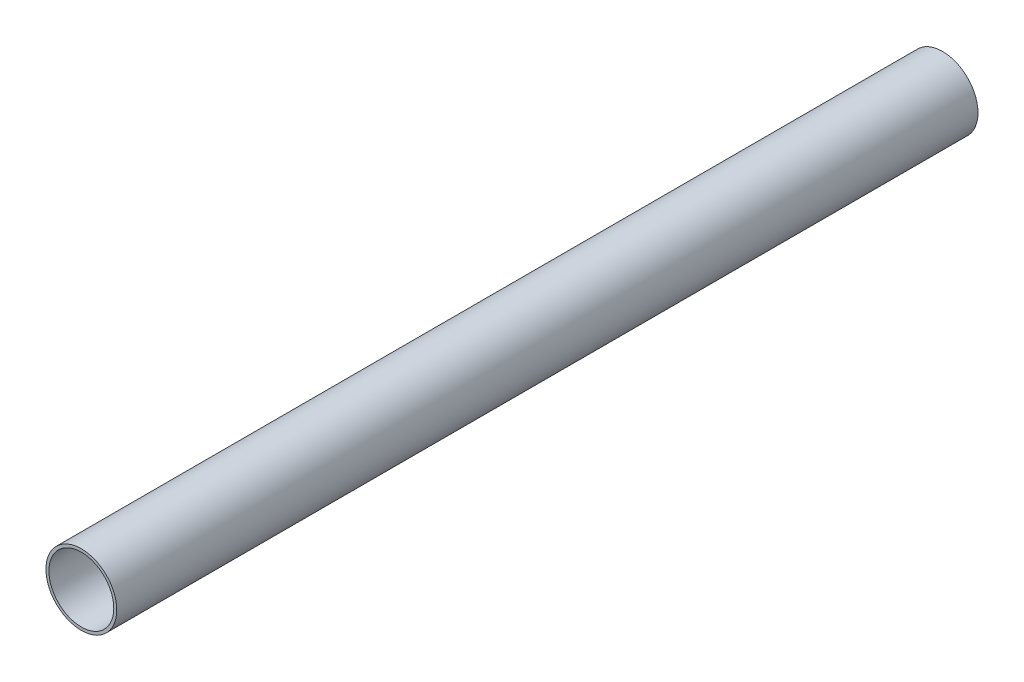
ISO-10303-21;
HEADER;
FILE_DESCRIPTION(('STEP AP214'),'2;1');
FILE_NAME('part.step','',(''),(''),'','','');
FILE_SCHEMA(('AUTOMOTIVE_DESIGN { 1 0 10303 214 1 1 1 1 }'));
ENDSEC;
DATA;
#1=APPLICATION_CONTEXT('core data for automotive mechanical design processes');
#2=APPLICATION_PROTOCOL_DEFINITION('international standard','automotive_design',2000,#1);
#3=PRODUCT_CONTEXT('',#1,'mechanical');
#4=PRODUCT('Part','Part','',(#3));
#5=PRODUCT_RELATED_PRODUCT_CATEGORY('part','',(#4));
#6=PRODUCT_DEFINITION_FORMATION('','',#4);
#7=PRODUCT_DEFINITION_CONTEXT('part definition',#1,'design');
#8=PRODUCT_DEFINITION('design','',#6,#7);
#9=PRODUCT_DEFINITION_SHAPE('','',#8);
#10=(LENGTH_UNIT() NAMED_UNIT(*) SI_UNIT(.MILLI.,.METRE.));
#11=(NAMED_UNIT(*) PLANE_ANGLE_UNIT() SI_UNIT($,.RADIAN.));
#12=(NAMED_UNIT(*) SI_UNIT($,.STERADIAN.) SOLID_ANGLE_UNIT());
#13=UNCERTAINTY_MEASURE_WITH_UNIT(LENGTH_MEASURE(1.E-05),#10,'distance_accuracy_value','');
#14=(GEOMETRIC_REPRESENTATION_CONTEXT(3) GLOBAL_UNCERTAINTY_ASSIGNED_CONTEXT((#13)) GLOBAL_UNIT_ASSIGNED_CONTEXT((#10,
#11,#12)) REPRESENTATION_CONTEXT('',''));
#15=CARTESIAN_POINT('',(0.,0.,0.));
#16=DIRECTION('',(0.,0.,1.));
#17=DIRECTION('',(1.,0.,0.));
#18=AXIS2_PLACEMENT_3D('',#15,#16,#17);
#19=CARTESIAN_POINT('',(0.,0.,463.55));
#20=DIRECTION('',(0.,0.,1.));
#21=DIRECTION('',(1.,0.,0.));
#22=AXIS2_PLACEMENT_3D('',#19,#20,#21);
#23=PLANE('',#22);
#24=CARTESIAN_POINT('',(0.,0.,463.55));
#25=DIRECTION('',(0.,0.,1.));
#26=DIRECTION('',(1.,0.,0.));
#27=AXIS2_PLACEMENT_3D('',#24,#25,#26);
#28=CIRCLE('',#27,19.05);
#29=CARTESIAN_POINT('',(19.05,0.,463.55));
#30=VERTEX_POINT('',#29);
#31=EDGE_CURVE('E10',#30,#30,#28,.T.);
#32=ORIENTED_EDGE('',*,*,#31,.T.);
#33=EDGE_LOOP('',(#32));
#34=FACE_BOUND('',#33,.T.);
#35=CARTESIAN_POINT('',(0.,0.,463.55));
#36=DIRECTION('',(0.,0.,1.));
#37=DIRECTION('',(1.,0.,0.));
#38=AXIS2_PLACEMENT_3D('',#35,#36,#37);
#39=CIRCLE('',#38,17.4625);
#40=CARTESIAN_POINT('',(17.4625,0.,463.55));
#41=VERTEX_POINT('',#40);
#42=EDGE_CURVE('E54',#41,#41,#39,.T.);
#43=ORIENTED_EDGE('',*,*,#42,.F.);
#44=EDGE_LOOP('',(#43));
#45=FACE_BOUND('',#44,.T.);
#46=ADVANCED_FACE('F41',(#34,#45),#23,.T.);
#47=CARTESIAN_POINT('',(0.,0.,0.));
#48=DIRECTION('',(0.,0.,1.));
#49=DIRECTION('',(1.,0.,0.));
#50=AXIS2_PLACEMENT_3D('',#47,#48,#49);
#51=PLANE('',#50);
#52=CARTESIAN_POINT('',(0.,0.,0.));
#53=DIRECTION('',(0.,0.,1.));
#54=DIRECTION('',(1.,0.,0.));
#55=AXIS2_PLACEMENT_3D('',#52,#53,#54);
#56=CIRCLE('',#55,19.05);
#57=CARTESIAN_POINT('',(19.05,0.,0.));
#58=VERTEX_POINT('',#57);
#59=EDGE_CURVE('E45',#58,#58,#56,.T.);
#60=ORIENTED_EDGE('',*,*,#59,.F.);
#61=EDGE_LOOP('',(#60));
#62=FACE_BOUND('',#61,.T.);
#63=CARTESIAN_POINT('',(0.,0.,0.));
#64=DIRECTION('',(0.,0.,1.));
#65=DIRECTION('',(1.,0.,0.));
#66=AXIS2_PLACEMENT_3D('',#63,#64,#65);
#67=CIRCLE('',#66,17.4625);
#68=CARTESIAN_POINT('',(17.4625,0.,0.));
#69=VERTEX_POINT('',#68);
#70=EDGE_CURVE('E56',#69,#69,#67,.T.);
#71=ORIENTED_EDGE('',*,*,#70,.T.);
#72=EDGE_LOOP('',(#71));
#73=FACE_BOUND('',#72,.T.);
#74=ADVANCED_FACE('F68',(#62,#73),#51,.F.);
#75=CARTESIAN_POINT('',(0.,0.,463.55));
#76=DIRECTION('',(0.,0.,-1.));
#77=DIRECTION('',(-1.,0.,0.));
#78=AXIS2_PLACEMENT_3D('',#75,#76,#77);
#79=CYLINDRICAL_SURFACE('',#78,19.05);
#80=ORIENTED_EDGE('',*,*,#31,.F.);
#81=EDGE_LOOP('',(#80));
#82=FACE_BOUND('',#81,.T.);
#83=ORIENTED_EDGE('',*,*,#59,.T.);
#84=EDGE_LOOP('',(#83));
#85=FACE_BOUND('',#84,.T.);
#86=ADVANCED_FACE('F43',(#82,#85),#79,.T.);
#87=CARTESIAN_POINT('',(0.,0.,463.55));
#88=DIRECTION('',(0.,0.,-1.));
#89=DIRECTION('',(-1.,0.,0.));
#90=AXIS2_PLACEMENT_3D('',#87,#88,#89);
#91=CYLINDRICAL_SURFACE('',#90,17.4625);
#92=ORIENTED_EDGE('',*,*,#42,.T.);
#93=EDGE_LOOP('',(#92));
#94=FACE_BOUND('',#93,.T.);
#95=ORIENTED_EDGE('',*,*,#70,.F.);
#96=EDGE_LOOP('',(#95));
#97=FACE_BOUND('',#96,.T.);
#98=ADVANCED_FACE('F64',(#94,#97),#91,.F.);
#99=CLOSED_SHELL('',(#46,#74,#86,#98));
#100=MANIFOLD_SOLID_BREP('B2',#99);
#101=ADVANCED_BREP_SHAPE_REPRESENTATION('',(#18,#100),#14);
#102=SHAPE_DEFINITION_REPRESENTATION(#9,#101);
ENDSEC;
END-ISO-10303-21;
